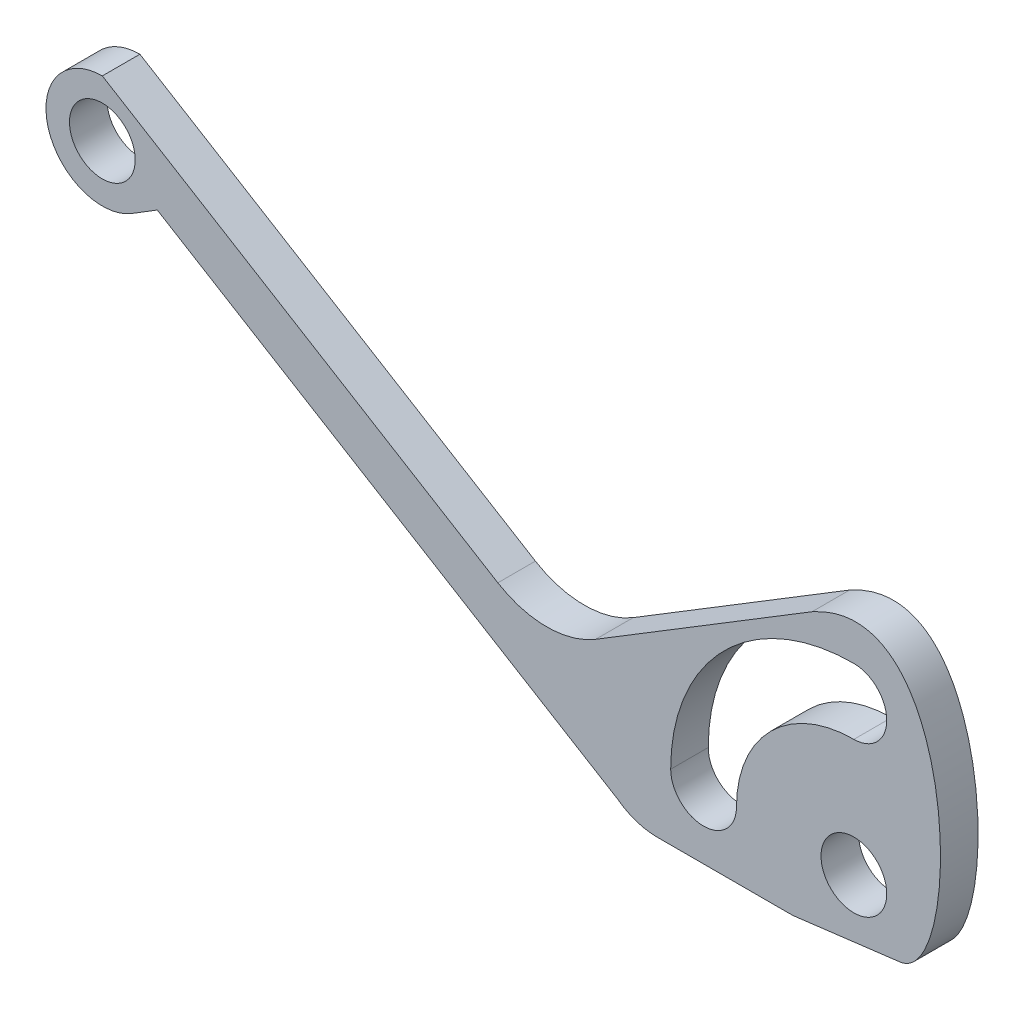
ISO-10303-21;
HEADER;
FILE_DESCRIPTION(('STEP AP214'),'2;1');
FILE_NAME('part.step','',(''),(''),'','','');
FILE_SCHEMA(('AUTOMOTIVE_DESIGN { 1 0 10303 214 1 1 1 1 }'));
ENDSEC;
DATA;
#1=APPLICATION_CONTEXT('core data for automotive mechanical design processes');
#2=APPLICATION_PROTOCOL_DEFINITION('international standard','automotive_design',2000,#1);
#3=PRODUCT_CONTEXT('',#1,'mechanical');
#4=PRODUCT('Part','Part','',(#3));
#5=PRODUCT_RELATED_PRODUCT_CATEGORY('part','',(#4));
#6=PRODUCT_DEFINITION_FORMATION('','',#4);
#7=PRODUCT_DEFINITION_CONTEXT('part definition',#1,'design');
#8=PRODUCT_DEFINITION('design','',#6,#7);
#9=PRODUCT_DEFINITION_SHAPE('','',#8);
#10=(LENGTH_UNIT() NAMED_UNIT(*) SI_UNIT(.MILLI.,.METRE.));
#11=(NAMED_UNIT(*) PLANE_ANGLE_UNIT() SI_UNIT($,.RADIAN.));
#12=(NAMED_UNIT(*) SI_UNIT($,.STERADIAN.) SOLID_ANGLE_UNIT());
#13=UNCERTAINTY_MEASURE_WITH_UNIT(LENGTH_MEASURE(1.E-05),#10,'distance_accuracy_value','');
#14=(GEOMETRIC_REPRESENTATION_CONTEXT(3) GLOBAL_UNCERTAINTY_ASSIGNED_CONTEXT((#13)) GLOBAL_UNIT_ASSIGNED_CONTEXT((#10,
#11,#12)) REPRESENTATION_CONTEXT('',''));
#15=CARTESIAN_POINT('',(0.,0.,0.));
#16=DIRECTION('',(0.,0.,1.));
#17=DIRECTION('',(1.,0.,0.));
#18=AXIS2_PLACEMENT_3D('',#15,#16,#17);
#19=CARTESIAN_POINT('',(52.7924166182452,-18.2958072283545,3.00000218434006));
#20=DIRECTION('',(0.,0.,-1.));
#21=DIRECTION('',(-1.,0.,0.));
#22=AXIS2_PLACEMENT_3D('',#19,#20,#21);
#23=CYLINDRICAL_SURFACE('',#22,19.5);
#24=CARTESIAN_POINT('',(52.7924166182452,-18.2958072283545,-0.999997815659936));
#25=DIRECTION('',(0.,0.,1.));
#26=DIRECTION('',(1.,0.,0.));
#27=AXIS2_PLACEMENT_3D('',#24,#25,#26);
#28=CIRCLE('',#27,19.5);
#29=CARTESIAN_POINT('',(52.7924166182452,1.20419277164555,-0.999997815659936));
#30=VERTEX_POINT('',#29);
#31=CARTESIAN_POINT('',(33.2924166182452,-18.2958072283545,-0.999997815659936));
#32=VERTEX_POINT('',#31);
#33=EDGE_CURVE('E222',#30,#32,#28,.T.);
#34=ORIENTED_EDGE('',*,*,#33,.F.);
#35=DIRECTION('',(0.,0.,-1.));
#36=VECTOR('',#35,1.);
#37=CARTESIAN_POINT('',(52.7924166182452,1.20419277164555,3.00000218434006));
#38=LINE('',#37,#36);
#39=CARTESIAN_POINT('',(52.7924166182452,1.20419277164555,3.00000218434006));
#40=VERTEX_POINT('',#39);
#41=EDGE_CURVE('E11',#40,#30,#38,.T.);
#42=ORIENTED_EDGE('',*,*,#41,.F.);
#43=CARTESIAN_POINT('',(52.7924166182452,-18.2958072283545,3.00000218434006));
#44=DIRECTION('',(0.,0.,1.));
#45=DIRECTION('',(1.,0.,0.));
#46=AXIS2_PLACEMENT_3D('',#43,#44,#45);
#47=CIRCLE('',#46,19.5);
#48=CARTESIAN_POINT('',(33.2924166182452,-18.2958072283545,3.00000218434006));
#49=VERTEX_POINT('',#48);
#50=EDGE_CURVE('E173',#40,#49,#47,.T.);
#51=ORIENTED_EDGE('',*,*,#50,.T.);
#52=DIRECTION('',(0.,0.,-1.));
#53=VECTOR('',#52,1.);
#54=CARTESIAN_POINT('',(33.2924166182452,-18.2958072283545,3.00000218434006));
#55=LINE('',#54,#53);
#56=EDGE_CURVE('E59',#49,#32,#55,.T.);
#57=ORIENTED_EDGE('',*,*,#56,.T.);
#58=EDGE_LOOP('',(#34,#42,#51,#57));
#59=FACE_BOUND('',#58,.T.);
#60=ADVANCED_FACE('F39',(#59),#23,.F.);
#61=CARTESIAN_POINT('',(52.7924166182452,-2.29580722835445,3.00000218434006));
#62=DIRECTION('',(0.,0.,-1.));
#63=DIRECTION('',(-1.,0.,0.));
#64=AXIS2_PLACEMENT_3D('',#61,#62,#63);
#65=CYLINDRICAL_SURFACE('',#64,3.5);
#66=CARTESIAN_POINT('',(52.7924166182452,-2.29580722835445,-0.999997815659936));
#67=DIRECTION('',(0.,0.,1.));
#68=DIRECTION('',(1.,0.,0.));
#69=AXIS2_PLACEMENT_3D('',#66,#67,#68);
#70=CIRCLE('',#69,3.5);
#71=CARTESIAN_POINT('',(52.7924166182452,-5.79580722835445,-0.999997815659936));
#72=VERTEX_POINT('',#71);
#73=EDGE_CURVE('E160',#72,#30,#70,.T.);
#74=ORIENTED_EDGE('',*,*,#73,.F.);
#75=DIRECTION('',(0.,0.,-1.));
#76=VECTOR('',#75,1.);
#77=CARTESIAN_POINT('',(52.7924166182452,-5.79580722835445,3.00000218434006));
#78=LINE('',#77,#76);
#79=CARTESIAN_POINT('',(52.7924166182452,-5.79580722835445,3.00000218434006));
#80=VERTEX_POINT('',#79);
#81=EDGE_CURVE('E50',#80,#72,#78,.T.);
#82=ORIENTED_EDGE('',*,*,#81,.F.);
#83=CARTESIAN_POINT('',(52.7924166182452,-2.29580722835445,3.00000218434006));
#84=DIRECTION('',(0.,0.,1.));
#85=DIRECTION('',(1.,0.,0.));
#86=AXIS2_PLACEMENT_3D('',#83,#84,#85);
#87=CIRCLE('',#86,3.5);
#88=EDGE_CURVE('E158',#80,#40,#87,.T.);
#89=ORIENTED_EDGE('',*,*,#88,.T.);
#90=ORIENTED_EDGE('',*,*,#41,.T.);
#91=EDGE_LOOP('',(#74,#82,#89,#90));
#92=FACE_BOUND('',#91,.T.);
#93=ADVANCED_FACE('F156',(#92),#65,.F.);
#94=CARTESIAN_POINT('',(52.7924166182452,-18.2958072283545,3.00000218434006));
#95=DIRECTION('',(0.,0.,-1.));
#96=DIRECTION('',(-1.,0.,0.));
#97=AXIS2_PLACEMENT_3D('',#94,#95,#96);
#98=CYLINDRICAL_SURFACE('',#97,12.5);
#99=CARTESIAN_POINT('',(52.7924166182452,-18.2958072283545,-0.999997815659936));
#100=DIRECTION('',(0.,0.,1.));
#101=DIRECTION('',(1.,0.,0.));
#102=AXIS2_PLACEMENT_3D('',#99,#100,#101);
#103=CIRCLE('',#102,12.5);
#104=CARTESIAN_POINT('',(40.2924166182452,-18.2958072283545,-0.999997815659936));
#105=VERTEX_POINT('',#104);
#106=EDGE_CURVE('E225',#72,#105,#103,.T.);
#107=ORIENTED_EDGE('',*,*,#106,.T.);
#108=DIRECTION('',(0.,0.,-1.));
#109=VECTOR('',#108,1.);
#110=CARTESIAN_POINT('',(40.2924166182452,-18.2958072283545,3.00000218434006));
#111=LINE('',#110,#109);
#112=CARTESIAN_POINT('',(40.2924166182452,-18.2958072283545,3.00000218434006));
#113=VERTEX_POINT('',#112);
#114=EDGE_CURVE('E106',#113,#105,#111,.T.);
#115=ORIENTED_EDGE('',*,*,#114,.F.);
#116=CARTESIAN_POINT('',(52.7924166182452,-18.2958072283545,3.00000218434006));
#117=DIRECTION('',(0.,0.,1.));
#118=DIRECTION('',(1.,0.,0.));
#119=AXIS2_PLACEMENT_3D('',#116,#117,#118);
#120=CIRCLE('',#119,12.5);
#121=EDGE_CURVE('E164',#80,#113,#120,.T.);
#122=ORIENTED_EDGE('',*,*,#121,.F.);
#123=ORIENTED_EDGE('',*,*,#81,.T.);
#124=EDGE_LOOP('',(#107,#115,#122,#123));
#125=FACE_BOUND('',#124,.T.);
#126=ADVANCED_FACE('F165',(#125),#98,.T.);
#127=CARTESIAN_POINT('',(48.3414781722362,3.74466775140217,3.00000218434006));
#128=CARTESIAN_POINT('',(64.0974243217247,12.5174858022186,3.00000218434006));
#129=CARTESIAN_POINT('',(64.8260527657566,-23.0961414755982,3.00000218434006));
#130=CARTESIAN_POINT('',(57.6451770189277,-23.8741374808845,3.00000218434006));
#131=B_SPLINE_CURVE_WITH_KNOTS('',3,(#127,#128,#129,#130),.UNSPECIFIED.,.F.,.F.,(4,4),(0.,1.),.UNSPECIFIED.);
#132=DIRECTION('',(0.,0.,-1.));
#133=VECTOR('',#132,1.);
#134=SURFACE_OF_LINEAR_EXTRUSION('',#131,#133);
#135=CARTESIAN_POINT('',(48.3414781722362,3.74466775140217,-0.999997815659936));
#136=CARTESIAN_POINT('',(64.0974243217247,12.5174858022186,-0.999997815659936));
#137=CARTESIAN_POINT('',(64.8260527657566,-23.0961414755982,-0.999997815659936));
#138=CARTESIAN_POINT('',(57.6451770189277,-23.8741374808845,-0.999997815659936));
#139=B_SPLINE_CURVE_WITH_KNOTS('',3,(#135,#136,#137,#138),.UNSPECIFIED.,.F.,.F.,(4,4),(0.,1.),.UNSPECIFIED.);
#140=CARTESIAN_POINT('',(48.3414781722362,3.74466775140216,-0.999997815659936));
#141=VERTEX_POINT('',#140);
#142=CARTESIAN_POINT('',(57.6451770189277,-23.8741374808846,-0.999997815659936));
#143=VERTEX_POINT('',#142);
#144=EDGE_CURVE('E187',#141,#143,#139,.T.);
#145=ORIENTED_EDGE('',*,*,#144,.F.);
#146=DIRECTION('',(0.,0.,-1.));
#147=VECTOR('',#146,1.);
#148=CARTESIAN_POINT('',(48.3414781722362,3.74466775140216,3.00000218434006));
#149=LINE('',#148,#147);
#150=CARTESIAN_POINT('',(48.3414781722362,3.74466775140216,3.00000218434006));
#151=VERTEX_POINT('',#150);
#152=EDGE_CURVE('E44',#151,#141,#149,.T.);
#153=ORIENTED_EDGE('',*,*,#152,.F.);
#154=CARTESIAN_POINT('',(57.6451770189277,-23.8741374808846,3.00000218434006));
#155=VERTEX_POINT('',#154);
#156=EDGE_CURVE('E236',#151,#155,#131,.T.);
#157=ORIENTED_EDGE('',*,*,#156,.T.);
#158=DIRECTION('',(0.,0.,-1.));
#159=VECTOR('',#158,1.);
#160=CARTESIAN_POINT('',(57.6451770189277,-23.8741374808846,3.00000218434006));
#161=LINE('',#160,#159);
#162=EDGE_CURVE('E186',#155,#143,#161,.T.);
#163=ORIENTED_EDGE('',*,*,#162,.T.);
#164=EDGE_LOOP('',(#145,#153,#157,#163));
#165=FACE_BOUND('',#164,.T.);
#166=ADVANCED_FACE('F41',(#165),#134,.T.);
#167=CARTESIAN_POINT('',(-4.20319635112102,-28.3261201139688,3.00000218434006));
#168=DIRECTION('',(0.52097864213099,-0.853569712702688,0.));
#169=DIRECTION('',(0.853569712702688,0.520978642130991,0.));
#170=AXIS2_PLACEMENT_3D('',#167,#168,#169);
#171=PLANE('',#170);
#172=DIRECTION('',(-0.853569712702688,-0.520978642130991,0.));
#173=VECTOR('',#172,1.);
#174=CARTESIAN_POINT('',(-4.20319635112102,-28.3261201139688,-0.999997815659936));
#175=LINE('',#174,#173);
#176=CARTESIAN_POINT('',(25.3093978877398,-10.313026346102,-0.999997815659936));
#177=VERTEX_POINT('',#176);
#178=EDGE_CURVE('E192',#141,#177,#175,.T.);
#179=ORIENTED_EDGE('',*,*,#178,.T.);
#180=DIRECTION('',(0.,0.,-1.));
#181=VECTOR('',#180,1.);
#182=CARTESIAN_POINT('',(25.3093978877398,-10.313026346102,3.00000218434006));
#183=LINE('',#182,#181);
#184=CARTESIAN_POINT('',(25.3093978877398,-10.313026346102,3.00000218434006));
#185=VERTEX_POINT('',#184);
#186=EDGE_CURVE('E257',#185,#177,#183,.T.);
#187=ORIENTED_EDGE('',*,*,#186,.F.);
#188=DIRECTION('',(-0.853569712702688,-0.520978642130991,0.));
#189=VECTOR('',#188,1.);
#190=CARTESIAN_POINT('',(-4.20319635112102,-28.3261201139688,3.00000218434006));
#191=LINE('',#190,#189);
#192=EDGE_CURVE('E266',#151,#185,#191,.T.);
#193=ORIENTED_EDGE('',*,*,#192,.F.);
#194=ORIENTED_EDGE('',*,*,#152,.T.);
#195=EDGE_LOOP('',(#179,#187,#193,#194));
#196=FACE_BOUND('',#195,.T.);
#197=ADVANCED_FACE('F265',(#196),#171,.F.);
#198=CARTESIAN_POINT('',(20.0996114664299,-1.77732921907513,3.00000218434006));
#199=DIRECTION('',(0.,0.,-1.));
#200=DIRECTION('',(-1.,0.,0.));
#201=AXIS2_PLACEMENT_3D('',#198,#199,#200);
#202=CYLINDRICAL_SURFACE('',#201,10.);
#203=CARTESIAN_POINT('',(20.0996114664299,-1.77732921907513,-0.999997815659936));
#204=DIRECTION('',(0.,0.,1.));
#205=DIRECTION('',(1.,0.,0.));
#206=AXIS2_PLACEMENT_3D('',#203,#204,#205);
#207=CIRCLE('',#206,10.);
#208=CARTESIAN_POINT('',(14.8923445391585,-10.3145636160064,-0.999997815659936));
#209=VERTEX_POINT('',#208);
#210=EDGE_CURVE('E197',#177,#209,#207,.F.);
#211=ORIENTED_EDGE('',*,*,#210,.T.);
#212=DIRECTION('',(0.,0.,-1.));
#213=VECTOR('',#212,1.);
#214=CARTESIAN_POINT('',(14.8923445391585,-10.3145636160064,3.00000218434006));
#215=LINE('',#214,#213);
#216=CARTESIAN_POINT('',(14.8923445391585,-10.3145636160064,3.00000218434006));
#217=VERTEX_POINT('',#216);
#218=EDGE_CURVE('E255',#217,#209,#215,.T.);
#219=ORIENTED_EDGE('',*,*,#218,.F.);
#220=CARTESIAN_POINT('',(20.0996114664299,-1.77732921907513,3.00000218434006));
#221=DIRECTION('',(0.,0.,1.));
#222=DIRECTION('',(1.,0.,0.));
#223=AXIS2_PLACEMENT_3D('',#220,#221,#222);
#224=CIRCLE('',#223,10.);
#225=EDGE_CURVE('E316',#185,#217,#224,.F.);
#226=ORIENTED_EDGE('',*,*,#225,.F.);
#227=ORIENTED_EDGE('',*,*,#186,.T.);
#228=EDGE_LOOP('',(#211,#219,#226,#227));
#229=FACE_BOUND('',#228,.T.);
#230=ADVANCED_FACE('F315',(#229),#202,.F.);
#231=CARTESIAN_POINT('',(-24.5402438822246,13.7372550405343,3.00000218434006));
#232=DIRECTION('',(-0.520726692727136,-0.853723439693124,0.));
#233=DIRECTION('',(0.853723439693124,-0.520726692727136,0.));
#234=AXIS2_PLACEMENT_3D('',#231,#232,#233);
#235=PLANE('',#234);
#236=DIRECTION('',(-0.853723439693124,0.520726692727136,0.));
#237=VECTOR('',#236,1.);
#238=CARTESIAN_POINT('',(-24.5402438822246,13.7372550405343,-0.999997815659936));
#239=LINE('',#238,#237);
#240=CARTESIAN_POINT('',(-27.2075833817548,15.3641927716456,-0.999997815659936));
#241=VERTEX_POINT('',#240);
#242=EDGE_CURVE('E199',#209,#241,#239,.T.);
#243=ORIENTED_EDGE('',*,*,#242,.T.);
#244=DIRECTION('',(0.,0.,-1.));
#245=VECTOR('',#244,1.);
#246=CARTESIAN_POINT('',(-27.2075833817548,15.3641927716456,3.00000218434006));
#247=LINE('',#246,#245);
#248=CARTESIAN_POINT('',(-27.2075833817548,15.3641927716456,3.00000218434006));
#249=VERTEX_POINT('',#248);
#250=EDGE_CURVE('E252',#249,#241,#247,.T.);
#251=ORIENTED_EDGE('',*,*,#250,.F.);
#252=DIRECTION('',(-0.853723439693124,0.520726692727136,0.));
#253=VECTOR('',#252,1.);
#254=CARTESIAN_POINT('',(-24.5402438822246,13.7372550405343,3.00000218434006));
#255=LINE('',#254,#253);
#256=EDGE_CURVE('E314',#217,#249,#255,.T.);
#257=ORIENTED_EDGE('',*,*,#256,.F.);
#258=ORIENTED_EDGE('',*,*,#218,.T.);
#259=EDGE_LOOP('',(#243,#251,#257,#258));
#260=FACE_BOUND('',#259,.T.);
#261=ADVANCED_FACE('F311',(#260),#235,.F.);
#262=CARTESIAN_POINT('',(-27.2075833817548,9.36419277164555,3.00000218434006));
#263=DIRECTION('',(0.,0.,-1.));
#264=DIRECTION('',(-1.,0.,0.));
#265=AXIS2_PLACEMENT_3D('',#262,#263,#264);
#266=CYLINDRICAL_SURFACE('',#265,6.);
#267=CARTESIAN_POINT('',(-27.2075833817548,9.36419277164555,-0.999997815659936));
#268=DIRECTION('',(0.,0.,1.));
#269=DIRECTION('',(1.,0.,0.));
#270=AXIS2_PLACEMENT_3D('',#267,#268,#269);
#271=CIRCLE('',#270,6.);
#272=CARTESIAN_POINT('',(-24.0527054320691,4.2605915800763,-0.999997815659936));
#273=VERTEX_POINT('',#272);
#274=EDGE_CURVE('E201',#241,#273,#271,.T.);
#275=ORIENTED_EDGE('',*,*,#274,.T.);
#276=DIRECTION('',(0.,0.,-1.));
#277=VECTOR('',#276,1.);
#278=CARTESIAN_POINT('',(-24.0527054320691,4.2605915800763,3.00000218434006));
#279=LINE('',#278,#277);
#280=CARTESIAN_POINT('',(-24.0527054320691,4.2605915800763,3.00000218434006));
#281=VERTEX_POINT('',#280);
#282=EDGE_CURVE('E250',#281,#273,#279,.T.);
#283=ORIENTED_EDGE('',*,*,#282,.F.);
#284=CARTESIAN_POINT('',(-27.2075833817548,9.36419277164555,3.00000218434006));
#285=DIRECTION('',(0.,0.,1.));
#286=DIRECTION('',(1.,0.,0.));
#287=AXIS2_PLACEMENT_3D('',#284,#285,#286);
#288=CIRCLE('',#287,6.);
#289=EDGE_CURVE('E319',#249,#281,#288,.T.);
#290=ORIENTED_EDGE('',*,*,#289,.F.);
#291=ORIENTED_EDGE('',*,*,#250,.T.);
#292=EDGE_LOOP('',(#275,#283,#290,#291));
#293=FACE_BOUND('',#292,.T.);
#294=ADVANCED_FACE('F308',(#293),#266,.T.);
#295=CARTESIAN_POINT('',(-24.0527054320691,4.2605915800763,3.00000218434006));
#296=DIRECTION('',(0.52581299161428,-0.850600198594875,0.));
#297=DIRECTION('',(0.850600198594875,0.52581299161428,0.));
#298=AXIS2_PLACEMENT_3D('',#295,#296,#297);
#299=PLANE('',#298);
#300=DIRECTION('',(-0.850600198594875,-0.52581299161428,0.));
#301=VECTOR('',#300,1.);
#302=CARTESIAN_POINT('',(-24.0527054320691,4.2605915800763,-0.999997815659936));
#303=LINE('',#302,#301);
#304=CARTESIAN_POINT('',(-21.3615719838824,5.92416152934488,-0.999997815659936));
#305=VERTEX_POINT('',#304);
#306=EDGE_CURVE('E204',#305,#273,#303,.T.);
#307=ORIENTED_EDGE('',*,*,#306,.F.);
#308=DIRECTION('',(0.,0.,-1.));
#309=VECTOR('',#308,1.);
#310=CARTESIAN_POINT('',(-21.3615719838824,5.92416152934488,3.00000218434006));
#311=LINE('',#310,#309);
#312=CARTESIAN_POINT('',(-21.3615719838824,5.92416152934488,3.00000218434006));
#313=VERTEX_POINT('',#312);
#314=EDGE_CURVE('E248',#313,#305,#311,.T.);
#315=ORIENTED_EDGE('',*,*,#314,.F.);
#316=DIRECTION('',(-0.850600198594875,-0.52581299161428,0.));
#317=VECTOR('',#316,1.);
#318=CARTESIAN_POINT('',(-24.0527054320691,4.2605915800763,3.00000218434006));
#319=LINE('',#318,#317);
#320=EDGE_CURVE('E305',#313,#281,#319,.T.);
#321=ORIENTED_EDGE('',*,*,#320,.T.);
#322=ORIENTED_EDGE('',*,*,#282,.T.);
#323=EDGE_LOOP('',(#307,#315,#321,#322));
#324=FACE_BOUND('',#323,.T.);
#325=ADVANCED_FACE('F300',(#324),#299,.T.);
#326=CARTESIAN_POINT('',(-27.1565798027458,9.44806735672963,3.00000218434006));
#327=DIRECTION('',(0.51957141092415,0.854427029622945,0.));
#328=DIRECTION('',(-0.854427029622945,0.51957141092415,0.));
#329=AXIS2_PLACEMENT_3D('',#326,#327,#328);
#330=PLANE('',#329);
#331=DIRECTION('',(0.854427029622945,-0.51957141092415,0.));
#332=VECTOR('',#331,1.);
#333=CARTESIAN_POINT('',(-27.1565798027458,9.44806735672963,-0.999997815659936));
#334=LINE('',#333,#332);
#335=CARTESIAN_POINT('',(27.6412629985903,-23.8741374808845,-0.999997815659936));
#336=VERTEX_POINT('',#335);
#337=EDGE_CURVE('E207',#305,#336,#334,.T.);
#338=ORIENTED_EDGE('',*,*,#337,.T.);
#339=DIRECTION('',(0.,0.,-1.));
#340=VECTOR('',#339,1.);
#341=CARTESIAN_POINT('',(27.6412629985903,-23.8741374808845,3.00000218434006));
#342=LINE('',#341,#340);
#343=CARTESIAN_POINT('',(27.6412629985903,-23.8741374808845,3.00000218434006));
#344=VERTEX_POINT('',#343);
#345=EDGE_CURVE('E246',#344,#336,#342,.T.);
#346=ORIENTED_EDGE('',*,*,#345,.F.);
#347=DIRECTION('',(0.854427029622945,-0.51957141092415,0.));
#348=VECTOR('',#347,1.);
#349=CARTESIAN_POINT('',(-27.1565798027458,9.44806735672963,3.00000218434006));
#350=LINE('',#349,#348);
#351=EDGE_CURVE('E325',#313,#344,#350,.T.);
#352=ORIENTED_EDGE('',*,*,#351,.F.);
#353=ORIENTED_EDGE('',*,*,#314,.T.);
#354=EDGE_LOOP('',(#338,#346,#352,#353));
#355=FACE_BOUND('',#354,.T.);
#356=ADVANCED_FACE('F330',(#355),#330,.F.);
#357=CARTESIAN_POINT('',(31.8530462497038,-18.282994319988,3.00000218434006));
#358=DIRECTION('',(0.,0.,-1.));
#359=DIRECTION('',(-1.,0.,0.));
#360=AXIS2_PLACEMENT_3D('',#357,#358,#359);
#361=CYLINDRICAL_SURFACE('',#360,7.);
#362=CARTESIAN_POINT('',(31.8530462497038,-18.282994319988,-0.999997815659936));
#363=DIRECTION('',(0.,0.,1.));
#364=DIRECTION('',(1.,0.,0.));
#365=AXIS2_PLACEMENT_3D('',#362,#363,#364);
#366=CIRCLE('',#365,7.);
#367=CARTESIAN_POINT('',(31.8530462497038,-25.282994319988,-0.999997815659936));
#368=VERTEX_POINT('',#367);
#369=EDGE_CURVE('E210',#368,#336,#366,.F.);
#370=ORIENTED_EDGE('',*,*,#369,.F.);
#371=DIRECTION('',(0.,0.,-1.));
#372=VECTOR('',#371,1.);
#373=CARTESIAN_POINT('',(31.8530462497038,-25.282994319988,3.00000218434006));
#374=LINE('',#373,#372);
#375=CARTESIAN_POINT('',(31.8530462497038,-25.282994319988,3.00000218434006));
#376=VERTEX_POINT('',#375);
#377=EDGE_CURVE('E244',#376,#368,#374,.T.);
#378=ORIENTED_EDGE('',*,*,#377,.F.);
#379=CARTESIAN_POINT('',(31.8530462497038,-18.282994319988,3.00000218434006));
#380=DIRECTION('',(0.,0.,1.));
#381=DIRECTION('',(1.,0.,0.));
#382=AXIS2_PLACEMENT_3D('',#379,#380,#381);
#383=CIRCLE('',#382,7.);
#384=EDGE_CURVE('E327',#376,#344,#383,.F.);
#385=ORIENTED_EDGE('',*,*,#384,.T.);
#386=ORIENTED_EDGE('',*,*,#345,.T.);
#387=EDGE_LOOP('',(#370,#378,#385,#386));
#388=FACE_BOUND('',#387,.T.);
#389=ADVANCED_FACE('F293',(#388),#361,.T.);
#390=CARTESIAN_POINT('',(-27.2075833817548,-25.282994319988,3.00000218434006));
#391=DIRECTION('',(0.,-1.,0.));
#392=DIRECTION('',(1.,0.,0.));
#393=AXIS2_PLACEMENT_3D('',#390,#391,#392);
#394=PLANE('',#393);
#395=DIRECTION('',(-1.,0.,0.));
#396=VECTOR('',#395,1.);
#397=CARTESIAN_POINT('',(-27.2075833817548,-25.282994319988,-0.999997815659936));
#398=LINE('',#397,#396);
#399=CARTESIAN_POINT('',(45.8547572450877,-25.282994319988,-0.999997815659936));
#400=VERTEX_POINT('',#399);
#401=EDGE_CURVE('E213',#400,#368,#398,.T.);
#402=ORIENTED_EDGE('',*,*,#401,.F.);
#403=DIRECTION('',(0.,0.,-1.));
#404=VECTOR('',#403,1.);
#405=CARTESIAN_POINT('',(45.8547572450877,-25.282994319988,3.00000218434006));
#406=LINE('',#405,#404);
#407=CARTESIAN_POINT('',(45.8547572450877,-25.282994319988,3.00000218434006));
#408=VERTEX_POINT('',#407);
#409=EDGE_CURVE('E242',#408,#400,#406,.T.);
#410=ORIENTED_EDGE('',*,*,#409,.F.);
#411=DIRECTION('',(-1.,0.,0.));
#412=VECTOR('',#411,1.);
#413=CARTESIAN_POINT('',(-27.2075833817548,-25.282994319988,3.00000218434006));
#414=LINE('',#413,#412);
#415=EDGE_CURVE('E289',#408,#376,#414,.T.);
#416=ORIENTED_EDGE('',*,*,#415,.T.);
#417=ORIENTED_EDGE('',*,*,#377,.T.);
#418=EDGE_LOOP('',(#402,#410,#416,#417));
#419=FACE_BOUND('',#418,.T.);
#420=ADVANCED_FACE('F287',(#419),#394,.T.);
#421=CARTESIAN_POINT('',(45.8547572450877,-18.282994319988,3.00000218434006));
#422=DIRECTION('',(0.,0.,-1.));
#423=DIRECTION('',(-1.,0.,0.));
#424=AXIS2_PLACEMENT_3D('',#421,#422,#423);
#425=CYLINDRICAL_SURFACE('',#424,7.);
#426=CARTESIAN_POINT('',(45.8547572450877,-18.282994319988,-0.999997815659936));
#427=DIRECTION('',(0.,0.,1.));
#428=DIRECTION('',(1.,0.,0.));
#429=AXIS2_PLACEMENT_3D('',#426,#427,#428);
#430=CIRCLE('',#429,7.);
#431=CARTESIAN_POINT('',(46.7164451853829,-25.2297557160308,-0.999997815659936));
#432=VERTEX_POINT('',#431);
#433=EDGE_CURVE('E216',#432,#400,#430,.F.);
#434=ORIENTED_EDGE('',*,*,#433,.F.);
#435=DIRECTION('',(0.,0.,-1.));
#436=VECTOR('',#435,1.);
#437=CARTESIAN_POINT('',(46.7164451853829,-25.2297557160308,3.00000218434006));
#438=LINE('',#437,#436);
#439=CARTESIAN_POINT('',(46.7164451853829,-25.2297557160308,3.00000218434006));
#440=VERTEX_POINT('',#439);
#441=EDGE_CURVE('E240',#440,#432,#438,.T.);
#442=ORIENTED_EDGE('',*,*,#441,.F.);
#443=CARTESIAN_POINT('',(45.8547572450877,-18.282994319988,3.00000218434006));
#444=DIRECTION('',(0.,0.,1.));
#445=DIRECTION('',(1.,0.,0.));
#446=AXIS2_PLACEMENT_3D('',#443,#444,#445);
#447=CIRCLE('',#446,7.);
#448=EDGE_CURVE('E283',#440,#408,#447,.F.);
#449=ORIENTED_EDGE('',*,*,#448,.T.);
#450=ORIENTED_EDGE('',*,*,#409,.T.);
#451=EDGE_LOOP('',(#434,#442,#449,#450));
#452=FACE_BOUND('',#451,.T.);
#453=ADVANCED_FACE('F280',(#452),#425,.T.);
#454=CARTESIAN_POINT('',(52.7924166182452,-18.2958072283545,3.00000218434006));
#455=DIRECTION('',(0.,0.,-1.));
#456=DIRECTION('',(-1.,0.,0.));
#457=AXIS2_PLACEMENT_3D('',#454,#455,#456);
#458=CYLINDRICAL_SURFACE('',#457,3.50000000000001);
#459=CARTESIAN_POINT('',(52.7924166182452,-18.2958072283545,3.00000218434006));
#460=DIRECTION('',(0.,0.,1.));
#461=DIRECTION('',(1.,0.,0.));
#462=AXIS2_PLACEMENT_3D('',#459,#460,#461);
#463=CIRCLE('',#462,3.50000000000001);
#464=CARTESIAN_POINT('',(56.2924166182452,-18.2958072283545,3.00000218434006));
#465=VERTEX_POINT('',#464);
#466=EDGE_CURVE('E180',#465,#465,#463,.T.);
#467=ORIENTED_EDGE('',*,*,#466,.T.);
#468=EDGE_LOOP('',(#467));
#469=FACE_BOUND('',#468,.T.);
#470=CARTESIAN_POINT('',(52.7924166182452,-18.2958072283545,-0.999997815659936));
#471=DIRECTION('',(0.,0.,1.));
#472=DIRECTION('',(1.,0.,0.));
#473=AXIS2_PLACEMENT_3D('',#470,#471,#472);
#474=CIRCLE('',#473,3.50000000000001);
#475=CARTESIAN_POINT('',(56.2924166182452,-18.2958072283545,-0.999997815659936));
#476=VERTEX_POINT('',#475);
#477=EDGE_CURVE('E230',#476,#476,#474,.T.);
#478=ORIENTED_EDGE('',*,*,#477,.F.);
#479=EDGE_LOOP('',(#478));
#480=FACE_BOUND('',#479,.T.);
#481=ADVANCED_FACE('F353',(#469,#480),#458,.F.);
#482=CARTESIAN_POINT('',(36.7924166182452,-18.2958072283545,3.00000218434006));
#483=DIRECTION('',(0.,0.,-1.));
#484=DIRECTION('',(-1.,0.,0.));
#485=AXIS2_PLACEMENT_3D('',#482,#483,#484);
#486=CYLINDRICAL_SURFACE('',#485,3.5);
#487=CARTESIAN_POINT('',(36.7924166182452,-18.2958072283545,-0.999997815659936));
#488=DIRECTION('',(0.,0.,1.));
#489=DIRECTION('',(1.,0.,0.));
#490=AXIS2_PLACEMENT_3D('',#487,#488,#489);
#491=CIRCLE('',#490,3.5);
#492=EDGE_CURVE('E227',#32,#105,#491,.T.);
#493=ORIENTED_EDGE('',*,*,#492,.F.);
#494=ORIENTED_EDGE('',*,*,#56,.F.);
#495=CARTESIAN_POINT('',(36.7924166182452,-18.2958072283545,3.00000218434006));
#496=DIRECTION('',(0.,0.,1.));
#497=DIRECTION('',(1.,0.,0.));
#498=AXIS2_PLACEMENT_3D('',#495,#496,#497);
#499=CIRCLE('',#498,3.5);
#500=EDGE_CURVE('E168',#49,#113,#499,.T.);
#501=ORIENTED_EDGE('',*,*,#500,.T.);
#502=ORIENTED_EDGE('',*,*,#114,.T.);
#503=EDGE_LOOP('',(#493,#494,#501,#502));
#504=FACE_BOUND('',#503,.T.);
#505=ADVANCED_FACE('F350',(#504),#486,.F.);
#506=CARTESIAN_POINT('',(-21.8613311247799,-33.7362581636876,3.00000218434006));
#507=DIRECTION('',(0.123098277185022,-0.992394485148965,0.));
#508=DIRECTION('',(0.992394485148965,0.123098277185022,0.));
#509=AXIS2_PLACEMENT_3D('',#506,#507,#508);
#510=PLANE('',#509);
#511=DIRECTION('',(-0.992394485148965,-0.123098277185022,0.));
#512=VECTOR('',#511,1.);
#513=CARTESIAN_POINT('',(-21.8613311247799,-33.7362581636876,-0.999997815659936));
#514=LINE('',#513,#512);
#515=EDGE_CURVE('E219',#143,#432,#514,.T.);
#516=ORIENTED_EDGE('',*,*,#515,.F.);
#517=ORIENTED_EDGE('',*,*,#162,.F.);
#518=DIRECTION('',(-0.992394485148965,-0.123098277185022,0.));
#519=VECTOR('',#518,1.);
#520=CARTESIAN_POINT('',(-21.8613311247799,-33.7362581636876,3.00000218434006));
#521=LINE('',#520,#519);
#522=EDGE_CURVE('E175',#155,#440,#521,.T.);
#523=ORIENTED_EDGE('',*,*,#522,.T.);
#524=ORIENTED_EDGE('',*,*,#441,.T.);
#525=EDGE_LOOP('',(#516,#517,#523,#524));
#526=FACE_BOUND('',#525,.T.);
#527=ADVANCED_FACE('F276',(#526),#510,.T.);
#528=CARTESIAN_POINT('',(-27.2075833817548,9.36419277164555,3.00000218434006));
#529=DIRECTION('',(0.,0.,-1.));
#530=DIRECTION('',(-1.,0.,0.));
#531=AXIS2_PLACEMENT_3D('',#528,#529,#530);
#532=CYLINDRICAL_SURFACE('',#531,3.5);
#533=CARTESIAN_POINT('',(-27.2075833817548,9.36419277164555,3.00000218434006));
#534=DIRECTION('',(0.,0.,1.));
#535=DIRECTION('',(1.,0.,0.));
#536=AXIS2_PLACEMENT_3D('',#533,#534,#535);
#537=CIRCLE('',#536,3.5);
#538=CARTESIAN_POINT('',(-23.7075833817548,9.36419277164555,3.00000218434006));
#539=VERTEX_POINT('',#538);
#540=EDGE_CURVE('E183',#539,#539,#537,.T.);
#541=ORIENTED_EDGE('',*,*,#540,.T.);
#542=EDGE_LOOP('',(#541));
#543=FACE_BOUND('',#542,.T.);
#544=CARTESIAN_POINT('',(-27.2075833817548,9.36419277164555,-0.999997815659936));
#545=DIRECTION('',(0.,0.,1.));
#546=DIRECTION('',(1.,0.,0.));
#547=AXIS2_PLACEMENT_3D('',#544,#545,#546);
#548=CIRCLE('',#547,3.5);
#549=CARTESIAN_POINT('',(-23.7075833817548,9.36419277164555,-0.999997815659936));
#550=VERTEX_POINT('',#549);
#551=EDGE_CURVE('E233',#550,#550,#548,.T.);
#552=ORIENTED_EDGE('',*,*,#551,.F.);
#553=EDGE_LOOP('',(#552));
#554=FACE_BOUND('',#553,.T.);
#555=ADVANCED_FACE('F349',(#543,#554),#532,.F.);
#556=CARTESIAN_POINT('',(-27.2075833817548,9.36419277164555,3.00000218434006));
#557=DIRECTION('',(0.,0.,1.));
#558=DIRECTION('',(1.,0.,0.));
#559=AXIS2_PLACEMENT_3D('',#556,#557,#558);
#560=PLANE('',#559);
#561=ORIENTED_EDGE('',*,*,#156,.F.);
#562=ORIENTED_EDGE('',*,*,#192,.T.);
#563=ORIENTED_EDGE('',*,*,#225,.T.);
#564=ORIENTED_EDGE('',*,*,#256,.T.);
#565=ORIENTED_EDGE('',*,*,#289,.T.);
#566=ORIENTED_EDGE('',*,*,#320,.F.);
#567=ORIENTED_EDGE('',*,*,#351,.T.);
#568=ORIENTED_EDGE('',*,*,#384,.F.);
#569=ORIENTED_EDGE('',*,*,#415,.F.);
#570=ORIENTED_EDGE('',*,*,#448,.F.);
#571=ORIENTED_EDGE('',*,*,#522,.F.);
#572=EDGE_LOOP('',(#561,#562,#563,#564,#565,#566,#567,#568,#569,#570,#571));
#573=FACE_BOUND('',#572,.T.);
#574=ORIENTED_EDGE('',*,*,#50,.F.);
#575=ORIENTED_EDGE('',*,*,#88,.F.);
#576=ORIENTED_EDGE('',*,*,#121,.T.);
#577=ORIENTED_EDGE('',*,*,#500,.F.);
#578=EDGE_LOOP('',(#574,#575,#576,#577));
#579=FACE_BOUND('',#578,.T.);
#580=ORIENTED_EDGE('',*,*,#466,.F.);
#581=EDGE_LOOP('',(#580));
#582=FACE_BOUND('',#581,.T.);
#583=ORIENTED_EDGE('',*,*,#540,.F.);
#584=EDGE_LOOP('',(#583));
#585=FACE_BOUND('',#584,.T.);
#586=ADVANCED_FACE('F171',(#573,#579,#582,#585),#560,.T.);
#587=CARTESIAN_POINT('',(-27.2075833817548,9.36419277164555,-0.999997815659936));
#588=DIRECTION('',(0.,0.,1.));
#589=DIRECTION('',(1.,0.,0.));
#590=AXIS2_PLACEMENT_3D('',#587,#588,#589);
#591=PLANE('',#590);
#592=ORIENTED_EDGE('',*,*,#144,.T.);
#593=ORIENTED_EDGE('',*,*,#515,.T.);
#594=ORIENTED_EDGE('',*,*,#433,.T.);
#595=ORIENTED_EDGE('',*,*,#401,.T.);
#596=ORIENTED_EDGE('',*,*,#369,.T.);
#597=ORIENTED_EDGE('',*,*,#337,.F.);
#598=ORIENTED_EDGE('',*,*,#306,.T.);
#599=ORIENTED_EDGE('',*,*,#274,.F.);
#600=ORIENTED_EDGE('',*,*,#242,.F.);
#601=ORIENTED_EDGE('',*,*,#210,.F.);
#602=ORIENTED_EDGE('',*,*,#178,.F.);
#603=EDGE_LOOP('',(#592,#593,#594,#595,#596,#597,#598,#599,#600,#601,#602));
#604=FACE_BOUND('',#603,.T.);
#605=ORIENTED_EDGE('',*,*,#33,.T.);
#606=ORIENTED_EDGE('',*,*,#492,.T.);
#607=ORIENTED_EDGE('',*,*,#106,.F.);
#608=ORIENTED_EDGE('',*,*,#73,.T.);
#609=EDGE_LOOP('',(#605,#606,#607,#608));
#610=FACE_BOUND('',#609,.T.);
#611=ORIENTED_EDGE('',*,*,#477,.T.);
#612=EDGE_LOOP('',(#611));
#613=FACE_BOUND('',#612,.T.);
#614=ORIENTED_EDGE('',*,*,#551,.T.);
#615=EDGE_LOOP('',(#614));
#616=FACE_BOUND('',#615,.T.);
#617=ADVANCED_FACE('F269',(#604,#610,#613,#616),#591,.F.);
#618=CLOSED_SHELL('',(#60,#93,#126,#166,#197,#230,#261,#294,#325,#356,#389,#420,#453,#481,#505,
#527,#555,#586,#617));
#619=MANIFOLD_SOLID_BREP('B2',#618);
#620=ADVANCED_BREP_SHAPE_REPRESENTATION('',(#18,#619),#14);
#621=SHAPE_DEFINITION_REPRESENTATION(#9,#620);
ENDSEC;
END-ISO-10303-21;
